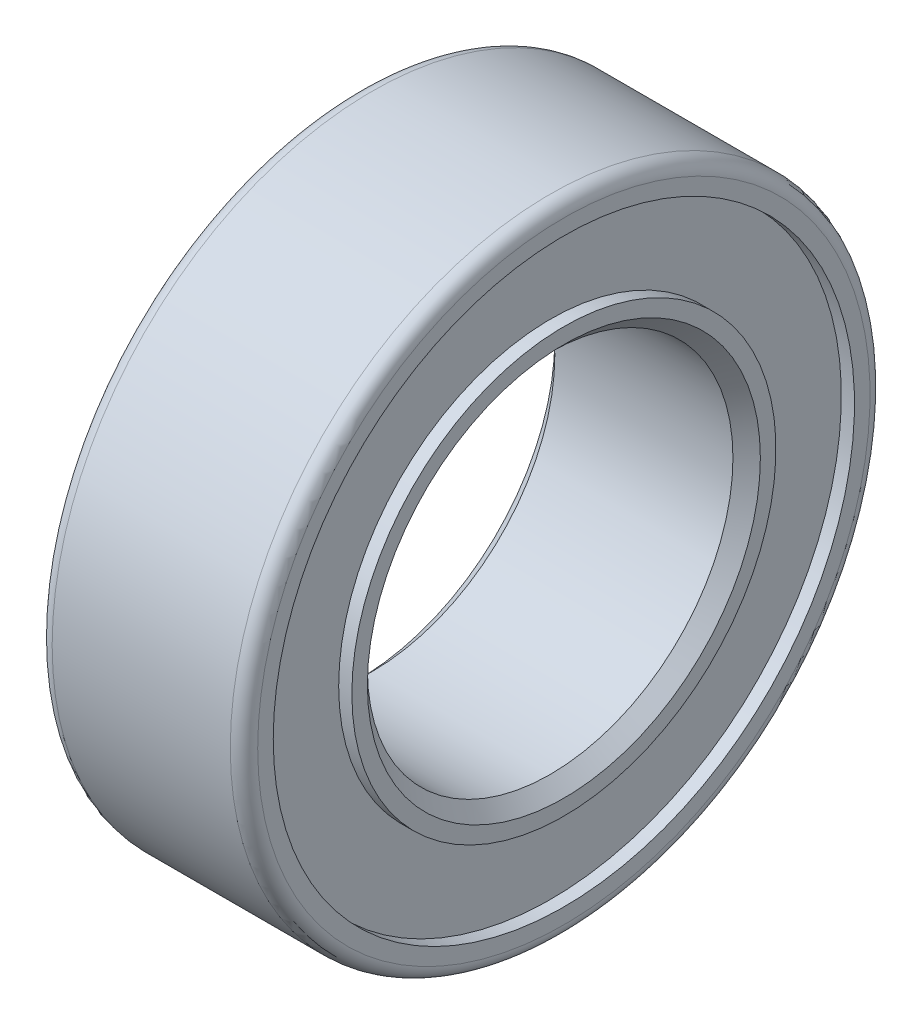
ISO-10303-21;
HEADER;
FILE_DESCRIPTION(('STEP AP214'),'2;1');
FILE_NAME('part.step','',(''),(''),'','','');
FILE_SCHEMA(('AUTOMOTIVE_DESIGN { 1 0 10303 214 1 1 1 1 }'));
ENDSEC;
DATA;
#1=APPLICATION_CONTEXT('core data for automotive mechanical design processes');
#2=APPLICATION_PROTOCOL_DEFINITION('international standard','automotive_design',2000,#1);
#3=PRODUCT_CONTEXT('',#1,'mechanical');
#4=PRODUCT('Part','Part','',(#3));
#5=PRODUCT_RELATED_PRODUCT_CATEGORY('part','',(#4));
#6=PRODUCT_DEFINITION_FORMATION('','',#4);
#7=PRODUCT_DEFINITION_CONTEXT('part definition',#1,'design');
#8=PRODUCT_DEFINITION('design','',#6,#7);
#9=PRODUCT_DEFINITION_SHAPE('','',#8);
#10=(LENGTH_UNIT() NAMED_UNIT(*) SI_UNIT(.MILLI.,.METRE.));
#11=(NAMED_UNIT(*) PLANE_ANGLE_UNIT() SI_UNIT($,.RADIAN.));
#12=(NAMED_UNIT(*) SI_UNIT($,.STERADIAN.) SOLID_ANGLE_UNIT());
#13=UNCERTAINTY_MEASURE_WITH_UNIT(LENGTH_MEASURE(1.E-05),#10,'distance_accuracy_value','');
#14=(GEOMETRIC_REPRESENTATION_CONTEXT(3) GLOBAL_UNCERTAINTY_ASSIGNED_CONTEXT((#13)) GLOBAL_UNIT_ASSIGNED_CONTEXT((#10,
#11,#12)) REPRESENTATION_CONTEXT('',''));
#15=CARTESIAN_POINT('',(0.,0.,0.));
#16=DIRECTION('',(0.,0.,1.));
#17=DIRECTION('',(1.,0.,0.));
#18=AXIS2_PLACEMENT_3D('',#15,#16,#17);
#19=CARTESIAN_POINT('',(3.5702240001001,7.366,0.));
#20=DIRECTION('',(1.,0.,0.));
#21=DIRECTION('',(0.,0.,-1.));
#22=AXIS2_PLACEMENT_3D('',#19,#20,#21);
#23=PLANE('',#22);
#24=CARTESIAN_POINT('',(3.5702240001001,0.,0.));
#25=DIRECTION('',(-1.,0.,0.));
#26=DIRECTION('',(0.,0.,1.));
#27=AXIS2_PLACEMENT_3D('',#24,#25,#26);
#28=CIRCLE('',#27,6.82625000001735);
#29=CARTESIAN_POINT('',(3.5702240001001,0.,6.82625000001735));
#30=VERTEX_POINT('',#29);
#31=EDGE_CURVE('E10',#30,#30,#28,.T.);
#32=ORIENTED_EDGE('',*,*,#31,.T.);
#33=EDGE_LOOP('',(#32));
#34=FACE_BOUND('',#33,.T.);
#35=CARTESIAN_POINT('',(3.5702240001001,0.,0.));
#36=DIRECTION('',(-1.,0.,0.));
#37=DIRECTION('',(0.,0.,1.));
#38=AXIS2_PLACEMENT_3D('',#35,#36,#37);
#39=CIRCLE('',#38,7.366);
#40=CARTESIAN_POINT('',(3.5702240001001,0.,7.366));
#41=VERTEX_POINT('',#40);
#42=EDGE_CURVE('E84',#41,#41,#39,.T.);
#43=ORIENTED_EDGE('',*,*,#42,.F.);
#44=EDGE_LOOP('',(#43));
#45=FACE_BOUND('',#44,.T.);
#46=ADVANCED_FACE('F32',(#34,#45),#23,.T.);
#47=CARTESIAN_POINT('',(3.5702240001001,0.,0.));
#48=DIRECTION('',(1.,0.,0.));
#49=DIRECTION('',(0.,0.,-1.));
#50=AXIS2_PLACEMENT_3D('',#47,#48,#49);
#51=CONICAL_SURFACE('',#50,6.82625000001735,0.785398163397448);
#52=CARTESIAN_POINT('',(3.09397400002354,0.,0.));
#53=DIRECTION('',(-1.,0.,0.));
#54=DIRECTION('',(0.,0.,1.));
#55=AXIS2_PLACEMENT_3D('',#52,#53,#54);
#56=CIRCLE('',#55,6.34999999994079);
#57=CARTESIAN_POINT('',(3.09397400002354,0.,6.34999999994079));
#58=VERTEX_POINT('',#57);
#59=EDGE_CURVE('E38',#58,#58,#56,.T.);
#60=ORIENTED_EDGE('',*,*,#59,.T.);
#61=EDGE_LOOP('',(#60));
#62=FACE_BOUND('',#61,.T.);
#63=ORIENTED_EDGE('',*,*,#31,.F.);
#64=EDGE_LOOP('',(#63));
#65=FACE_BOUND('',#64,.T.);
#66=ADVANCED_FACE('F92',(#62,#65),#51,.F.);
#67=CARTESIAN_POINT('',(3.57147400176893,0.,0.));
#68=DIRECTION('',(-1.,0.,0.));
#69=DIRECTION('',(0.,0.,1.));
#70=AXIS2_PLACEMENT_3D('',#67,#68,#69);
#71=CYLINDRICAL_SURFACE('',#70,6.34999999994079);
#72=CARTESIAN_POINT('',(-3.09397399996669,0.,0.));
#73=DIRECTION('',(-1.,0.,0.));
#74=DIRECTION('',(0.,0.,1.));
#75=AXIS2_PLACEMENT_3D('',#72,#73,#74);
#76=CIRCLE('',#75,6.34999999994079);
#77=CARTESIAN_POINT('',(-3.09397399996669,0.,6.34999999994079));
#78=VERTEX_POINT('',#77);
#79=EDGE_CURVE('E42',#78,#78,#76,.T.);
#80=ORIENTED_EDGE('',*,*,#79,.T.);
#81=EDGE_LOOP('',(#80));
#82=FACE_BOUND('',#81,.T.);
#83=ORIENTED_EDGE('',*,*,#59,.F.);
#84=EDGE_LOOP('',(#83));
#85=FACE_BOUND('',#84,.T.);
#86=ADVANCED_FACE('F96',(#82,#85),#71,.F.);
#87=CARTESIAN_POINT('',(-3.09397399996669,0.,0.));
#88=DIRECTION('',(-1.,0.,0.));
#89=DIRECTION('',(0.,0.,1.));
#90=AXIS2_PLACEMENT_3D('',#87,#88,#89);
#91=CONICAL_SURFACE('',#90,6.34999999994079,0.785398163397448);
#92=CARTESIAN_POINT('',(-3.57022399995799,0.,0.));
#93=DIRECTION('',(-1.,0.,0.));
#94=DIRECTION('',(0.,0.,1.));
#95=AXIS2_PLACEMENT_3D('',#92,#93,#94);
#96=CIRCLE('',#95,6.82624999993209);
#97=CARTESIAN_POINT('',(-3.57022399995799,0.,6.82624999993209));
#98=VERTEX_POINT('',#97);
#99=EDGE_CURVE('E46',#98,#98,#96,.T.);
#100=ORIENTED_EDGE('',*,*,#99,.T.);
#101=EDGE_LOOP('',(#100));
#102=FACE_BOUND('',#101,.T.);
#103=ORIENTED_EDGE('',*,*,#79,.F.);
#104=EDGE_LOOP('',(#103));
#105=FACE_BOUND('',#104,.T.);
#106=ADVANCED_FACE('F100',(#102,#105),#91,.F.);
#107=CARTESIAN_POINT('',(-3.57022399995799,6.82624999993209,0.));
#108=DIRECTION('',(-1.,0.,0.));
#109=DIRECTION('',(0.,0.,1.));
#110=AXIS2_PLACEMENT_3D('',#107,#108,#109);
#111=PLANE('',#110);
#112=CARTESIAN_POINT('',(-3.57022399995799,0.,0.));
#113=DIRECTION('',(-1.,0.,0.));
#114=DIRECTION('',(0.,0.,1.));
#115=AXIS2_PLACEMENT_3D('',#112,#113,#114);
#116=CIRCLE('',#115,7.366);
#117=CARTESIAN_POINT('',(-3.57022399995799,0.,7.366));
#118=VERTEX_POINT('',#117);
#119=EDGE_CURVE('E51',#118,#118,#116,.T.);
#120=ORIENTED_EDGE('',*,*,#119,.T.);
#121=EDGE_LOOP('',(#120));
#122=FACE_BOUND('',#121,.T.);
#123=ORIENTED_EDGE('',*,*,#99,.F.);
#124=EDGE_LOOP('',(#123));
#125=FACE_BOUND('',#124,.T.);
#126=ADVANCED_FACE('F107',(#122,#125),#111,.T.);
#127=CARTESIAN_POINT('',(3.57147400176893,0.,0.));
#128=DIRECTION('',(-1.,0.,0.));
#129=DIRECTION('',(0.,0.,1.));
#130=AXIS2_PLACEMENT_3D('',#127,#128,#129);
#131=CYLINDRICAL_SURFACE('',#130,7.366);
#132=CARTESIAN_POINT('',(-3.1130239998999,0.,0.));
#133=DIRECTION('',(-1.,0.,0.));
#134=DIRECTION('',(0.,0.,1.));
#135=AXIS2_PLACEMENT_3D('',#132,#133,#134);
#136=CIRCLE('',#135,7.366);
#137=CARTESIAN_POINT('',(-3.1130239998999,0.,7.366));
#138=VERTEX_POINT('',#137);
#139=EDGE_CURVE('E54',#138,#138,#136,.T.);
#140=ORIENTED_EDGE('',*,*,#139,.T.);
#141=EDGE_LOOP('',(#140));
#142=FACE_BOUND('',#141,.T.);
#143=ORIENTED_EDGE('',*,*,#119,.F.);
#144=EDGE_LOOP('',(#143));
#145=FACE_BOUND('',#144,.T.);
#146=ADVANCED_FACE('F111',(#142,#145),#131,.T.);
#147=CARTESIAN_POINT('',(-3.1130239998999,7.366,0.));
#148=DIRECTION('',(-1.,0.,0.));
#149=DIRECTION('',(0.,0.,1.));
#150=AXIS2_PLACEMENT_3D('',#147,#148,#149);
#151=PLANE('',#150);
#152=CARTESIAN_POINT('',(-3.1130239998999,0.,0.));
#153=DIRECTION('',(-1.,0.,0.));
#154=DIRECTION('',(0.,0.,1.));
#155=AXIS2_PLACEMENT_3D('',#152,#153,#154);
#156=CIRCLE('',#155,10.0965);
#157=CARTESIAN_POINT('',(-3.1130239998999,0.,10.0965));
#158=VERTEX_POINT('',#157);
#159=EDGE_CURVE('E57',#158,#158,#156,.T.);
#160=ORIENTED_EDGE('',*,*,#159,.T.);
#161=EDGE_LOOP('',(#160));
#162=FACE_BOUND('',#161,.T.);
#163=ORIENTED_EDGE('',*,*,#139,.F.);
#164=EDGE_LOOP('',(#163));
#165=FACE_BOUND('',#164,.T.);
#166=ADVANCED_FACE('F115',(#162,#165),#151,.T.);
#167=CARTESIAN_POINT('',(3.57147400176893,0.,0.));
#168=DIRECTION('',(-1.,0.,0.));
#169=DIRECTION('',(0.,0.,1.));
#170=AXIS2_PLACEMENT_3D('',#167,#168,#169);
#171=CYLINDRICAL_SURFACE('',#170,10.0965);
#172=CARTESIAN_POINT('',(-3.57022399995799,0.,0.));
#173=DIRECTION('',(-1.,0.,0.));
#174=DIRECTION('',(0.,0.,1.));
#175=AXIS2_PLACEMENT_3D('',#172,#173,#174);
#176=CIRCLE('',#175,10.0965);
#177=CARTESIAN_POINT('',(-3.57022399995799,0.,10.0965));
#178=VERTEX_POINT('',#177);
#179=EDGE_CURVE('E60',#178,#178,#176,.T.);
#180=ORIENTED_EDGE('',*,*,#179,.T.);
#181=EDGE_LOOP('',(#180));
#182=FACE_BOUND('',#181,.T.);
#183=ORIENTED_EDGE('',*,*,#159,.F.);
#184=EDGE_LOOP('',(#183));
#185=FACE_BOUND('',#184,.T.);
#186=ADVANCED_FACE('F119',(#182,#185),#171,.F.);
#187=CARTESIAN_POINT('',(-3.57022399995799,10.0965,0.));
#188=DIRECTION('',(-1.,0.,0.));
#189=DIRECTION('',(0.,0.,1.));
#190=AXIS2_PLACEMENT_3D('',#187,#188,#189);
#191=PLANE('',#190);
#192=CARTESIAN_POINT('',(-3.57022399995799,0.,0.));
#193=DIRECTION('',(-1.,0.,0.));
#194=DIRECTION('',(0.,0.,1.));
#195=AXIS2_PLACEMENT_3D('',#192,#193,#194);
#196=CIRCLE('',#195,10.63625);
#197=CARTESIAN_POINT('',(-3.57022399995799,0.,10.63625));
#198=VERTEX_POINT('',#197);
#199=EDGE_CURVE('E63',#198,#198,#196,.T.);
#200=ORIENTED_EDGE('',*,*,#199,.T.);
#201=EDGE_LOOP('',(#200));
#202=FACE_BOUND('',#201,.T.);
#203=ORIENTED_EDGE('',*,*,#179,.F.);
#204=EDGE_LOOP('',(#203));
#205=FACE_BOUND('',#204,.T.);
#206=ADVANCED_FACE('F123',(#202,#205),#191,.T.);
#207=CARTESIAN_POINT('',(-3.09397399995799,0.,0.));
#208=DIRECTION('',(-1.,0.,0.));
#209=DIRECTION('',(0.,0.,1.));
#210=AXIS2_PLACEMENT_3D('',#207,#208,#209);
#211=TOROIDAL_SURFACE('',#210,10.63625,0.476249999999999);
#212=CARTESIAN_POINT('',(-3.09397399995799,0.,0.));
#213=DIRECTION('',(-1.,0.,0.));
#214=DIRECTION('',(0.,0.,1.));
#215=AXIS2_PLACEMENT_3D('',#212,#213,#214);
#216=CIRCLE('',#215,11.1125);
#217=CARTESIAN_POINT('',(-3.09397399995799,0.,11.1125));
#218=VERTEX_POINT('',#217);
#219=EDGE_CURVE('E66',#218,#218,#216,.T.);
#220=ORIENTED_EDGE('',*,*,#219,.T.);
#221=EDGE_LOOP('',(#220));
#222=FACE_BOUND('',#221,.T.);
#223=ORIENTED_EDGE('',*,*,#199,.F.);
#224=EDGE_LOOP('',(#223));
#225=FACE_BOUND('',#224,.T.);
#226=ADVANCED_FACE('F127',(#222,#225),#211,.T.);
#227=CARTESIAN_POINT('',(3.57147400176893,0.,0.));
#228=DIRECTION('',(-1.,0.,0.));
#229=DIRECTION('',(0.,0.,1.));
#230=AXIS2_PLACEMENT_3D('',#227,#228,#229);
#231=CYLINDRICAL_SURFACE('',#230,11.1125);
#232=CARTESIAN_POINT('',(3.0939740001001,0.,0.));
#233=DIRECTION('',(-1.,0.,0.));
#234=DIRECTION('',(0.,0.,1.));
#235=AXIS2_PLACEMENT_3D('',#232,#233,#234);
#236=CIRCLE('',#235,11.1125);
#237=CARTESIAN_POINT('',(3.0939740001001,0.,11.1125));
#238=VERTEX_POINT('',#237);
#239=EDGE_CURVE('E69',#238,#238,#236,.T.);
#240=ORIENTED_EDGE('',*,*,#239,.T.);
#241=EDGE_LOOP('',(#240));
#242=FACE_BOUND('',#241,.T.);
#243=ORIENTED_EDGE('',*,*,#219,.F.);
#244=EDGE_LOOP('',(#243));
#245=FACE_BOUND('',#244,.T.);
#246=ADVANCED_FACE('F131',(#242,#245),#231,.T.);
#247=CARTESIAN_POINT('',(3.0939740001001,0.,0.));
#248=DIRECTION('',(-1.,0.,0.));
#249=DIRECTION('',(0.,0.,1.));
#250=AXIS2_PLACEMENT_3D('',#247,#248,#249);
#251=TOROIDAL_SURFACE('',#250,10.63625,0.476250000000001);
#252=CARTESIAN_POINT('',(3.5702240001001,0.,0.));
#253=DIRECTION('',(-1.,0.,0.));
#254=DIRECTION('',(0.,0.,1.));
#255=AXIS2_PLACEMENT_3D('',#252,#253,#254);
#256=CIRCLE('',#255,10.63625);
#257=CARTESIAN_POINT('',(3.5702240001001,0.,10.63625));
#258=VERTEX_POINT('',#257);
#259=EDGE_CURVE('E72',#258,#258,#256,.T.);
#260=ORIENTED_EDGE('',*,*,#259,.T.);
#261=EDGE_LOOP('',(#260));
#262=FACE_BOUND('',#261,.T.);
#263=ORIENTED_EDGE('',*,*,#239,.F.);
#264=EDGE_LOOP('',(#263));
#265=FACE_BOUND('',#264,.T.);
#266=ADVANCED_FACE('F135',(#262,#265),#251,.T.);
#267=CARTESIAN_POINT('',(3.5702240001001,10.63625,0.));
#268=DIRECTION('',(1.,0.,0.));
#269=DIRECTION('',(0.,0.,-1.));
#270=AXIS2_PLACEMENT_3D('',#267,#268,#269);
#271=PLANE('',#270);
#272=CARTESIAN_POINT('',(3.5702240001001,0.,0.));
#273=DIRECTION('',(-1.,0.,0.));
#274=DIRECTION('',(0.,0.,1.));
#275=AXIS2_PLACEMENT_3D('',#272,#273,#274);
#276=CIRCLE('',#275,10.0965);
#277=CARTESIAN_POINT('',(3.5702240001001,0.,10.0965));
#278=VERTEX_POINT('',#277);
#279=EDGE_CURVE('E75',#278,#278,#276,.T.);
#280=ORIENTED_EDGE('',*,*,#279,.T.);
#281=EDGE_LOOP('',(#280));
#282=FACE_BOUND('',#281,.T.);
#283=ORIENTED_EDGE('',*,*,#259,.F.);
#284=EDGE_LOOP('',(#283));
#285=FACE_BOUND('',#284,.T.);
#286=ADVANCED_FACE('F139',(#282,#285),#271,.T.);
#287=CARTESIAN_POINT('',(3.57147400176893,0.,0.));
#288=DIRECTION('',(-1.,0.,0.));
#289=DIRECTION('',(0.,0.,1.));
#290=AXIS2_PLACEMENT_3D('',#287,#288,#289);
#291=CYLINDRICAL_SURFACE('',#290,10.0965);
#292=CARTESIAN_POINT('',(3.1130240001001,0.,0.));
#293=DIRECTION('',(-1.,0.,0.));
#294=DIRECTION('',(0.,0.,1.));
#295=AXIS2_PLACEMENT_3D('',#292,#293,#294);
#296=CIRCLE('',#295,10.0965);
#297=CARTESIAN_POINT('',(3.1130240001001,0.,10.0965));
#298=VERTEX_POINT('',#297);
#299=EDGE_CURVE('E78',#298,#298,#296,.T.);
#300=ORIENTED_EDGE('',*,*,#299,.T.);
#301=EDGE_LOOP('',(#300));
#302=FACE_BOUND('',#301,.T.);
#303=ORIENTED_EDGE('',*,*,#279,.F.);
#304=EDGE_LOOP('',(#303));
#305=FACE_BOUND('',#304,.T.);
#306=ADVANCED_FACE('F143',(#302,#305),#291,.F.);
#307=CARTESIAN_POINT('',(3.1130240001001,10.0965,0.));
#308=DIRECTION('',(1.,0.,0.));
#309=DIRECTION('',(0.,0.,-1.));
#310=AXIS2_PLACEMENT_3D('',#307,#308,#309);
#311=PLANE('',#310);
#312=CARTESIAN_POINT('',(3.1130240001001,0.,0.));
#313=DIRECTION('',(-1.,0.,0.));
#314=DIRECTION('',(0.,0.,1.));
#315=AXIS2_PLACEMENT_3D('',#312,#313,#314);
#316=CIRCLE('',#315,7.366);
#317=CARTESIAN_POINT('',(3.1130240001001,0.,7.366));
#318=VERTEX_POINT('',#317);
#319=EDGE_CURVE('E81',#318,#318,#316,.T.);
#320=ORIENTED_EDGE('',*,*,#319,.T.);
#321=EDGE_LOOP('',(#320));
#322=FACE_BOUND('',#321,.T.);
#323=ORIENTED_EDGE('',*,*,#299,.F.);
#324=EDGE_LOOP('',(#323));
#325=FACE_BOUND('',#324,.T.);
#326=ADVANCED_FACE('F147',(#322,#325),#311,.T.);
#327=CARTESIAN_POINT('',(3.57147400176893,0.,0.));
#328=DIRECTION('',(-1.,0.,0.));
#329=DIRECTION('',(0.,0.,1.));
#330=AXIS2_PLACEMENT_3D('',#327,#328,#329);
#331=CYLINDRICAL_SURFACE('',#330,7.366);
#332=ORIENTED_EDGE('',*,*,#42,.T.);
#333=EDGE_LOOP('',(#332));
#334=FACE_BOUND('',#333,.T.);
#335=ORIENTED_EDGE('',*,*,#319,.F.);
#336=EDGE_LOOP('',(#335));
#337=FACE_BOUND('',#336,.T.);
#338=ADVANCED_FACE('F88',(#334,#337),#331,.T.);
#339=CLOSED_SHELL('',(#46,#66,#86,#106,#126,#146,#166,#186,#206,#226,#246,#266,#286,#306,#326,#338));
#340=MANIFOLD_SOLID_BREP('B2',#339);
#341=ADVANCED_BREP_SHAPE_REPRESENTATION('',(#18,#340),#14);
#342=SHAPE_DEFINITION_REPRESENTATION(#9,#341);
ENDSEC;
END-ISO-10303-21;
